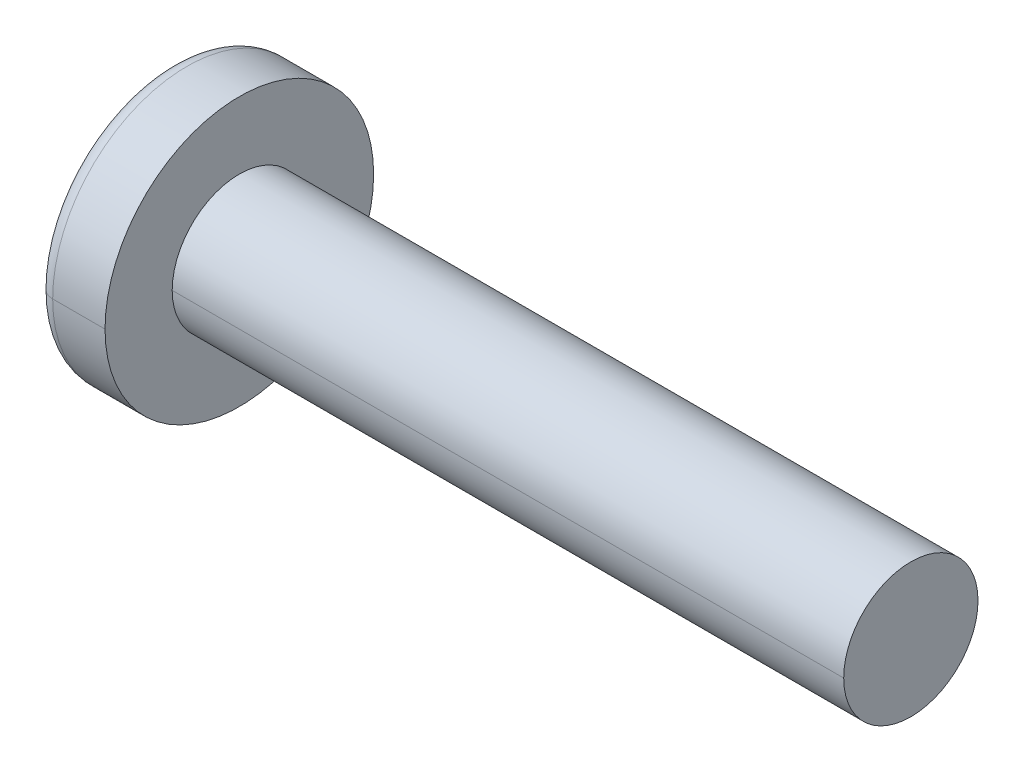
ISO-10303-21;
HEADER;
FILE_DESCRIPTION(('STEP AP214'),'2;1');
FILE_NAME('part.step','',(''),(''),'','','');
FILE_SCHEMA(('AUTOMOTIVE_DESIGN { 1 0 10303 214 1 1 1 1 }'));
ENDSEC;
DATA;
#1=APPLICATION_CONTEXT('core data for automotive mechanical design processes');
#2=APPLICATION_PROTOCOL_DEFINITION('international standard','automotive_design',2000,#1);
#3=PRODUCT_CONTEXT('',#1,'mechanical');
#4=PRODUCT('Part','Part','',(#3));
#5=PRODUCT_RELATED_PRODUCT_CATEGORY('part','',(#4));
#6=PRODUCT_DEFINITION_FORMATION('','',#4);
#7=PRODUCT_DEFINITION_CONTEXT('part definition',#1,'design');
#8=PRODUCT_DEFINITION('design','',#6,#7);
#9=PRODUCT_DEFINITION_SHAPE('','',#8);
#10=(LENGTH_UNIT() NAMED_UNIT(*) SI_UNIT(.MILLI.,.METRE.));
#11=(NAMED_UNIT(*) PLANE_ANGLE_UNIT() SI_UNIT($,.RADIAN.));
#12=(NAMED_UNIT(*) SI_UNIT($,.STERADIAN.) SOLID_ANGLE_UNIT());
#13=UNCERTAINTY_MEASURE_WITH_UNIT(LENGTH_MEASURE(1.E-05),#10,'distance_accuracy_value','');
#14=(GEOMETRIC_REPRESENTATION_CONTEXT(3) GLOBAL_UNCERTAINTY_ASSIGNED_CONTEXT((#13)) GLOBAL_UNIT_ASSIGNED_CONTEXT((#10,
#11,#12)) REPRESENTATION_CONTEXT('',''));
#15=CARTESIAN_POINT('',(0.,0.,0.));
#16=DIRECTION('',(0.,0.,1.));
#17=DIRECTION('',(1.,0.,0.));
#18=AXIS2_PLACEMENT_3D('',#15,#16,#17);
#19=CARTESIAN_POINT('',(1.37075949367089,-0.101772151898734,0.));
#20=DIRECTION('',(-0.100331502261417,0.994954064092392,0.));
#21=DIRECTION('',(0.,0.,1.));
#22=AXIS2_PLACEMENT_3D('',#19,#20,#21);
#23=PLANE('',#22);
#24=CARTESIAN_POINT('',(3.19174554351625,0.081856693463823,0.));
#25=DIRECTION('',(-0.100331502261417,0.994954064092392,0.));
#26=DIRECTION('',(-0.994954064092392,-0.100331502261417,0.));
#27=AXIS2_PLACEMENT_3D('',#24,#25,#26);
#28=CIRCLE('',#27,3.1989422229361);
#29=CARTESIAN_POINT('',(0.0177814447975943,-0.238206913129655,0.238206913129654));
#30=VERTEX_POINT('',#29);
#31=CARTESIAN_POINT('',(0.118330716626355,-0.22806749076037,0.831444314172419));
#32=VERTEX_POINT('',#31);
#33=EDGE_CURVE('E231',#30,#32,#28,.T.);
#34=ORIENTED_EDGE('',*,*,#33,.T.);
#35=DIRECTION('',(0.830201128729582,0.0837177608802956,-0.551141925795269));
#36=VECTOR('',#35,1.);
#37=CARTESIAN_POINT('',(0.,-0.240000000000002,0.91));
#38=LINE('',#37,#36);
#39=CARTESIAN_POINT('',(1.19,-0.12,0.12));
#40=VERTEX_POINT('',#39);
#41=EDGE_CURVE('E11',#32,#40,#38,.T.);
#42=ORIENTED_EDGE('',*,*,#41,.T.);
#43=DIRECTION('',(0.989983749746914,0.0998302940921256,-0.0998302940921253));
#44=VECTOR('',#43,1.);
#45=CARTESIAN_POINT('',(1.38081767298512,-0.100757881715786,0.100757881715786));
#46=LINE('',#45,#44);
#47=EDGE_CURVE('E207',#30,#40,#46,.T.);
#48=ORIENTED_EDGE('',*,*,#47,.F.);
#49=EDGE_LOOP('',(#34,#42,#48));
#50=FACE_BOUND('',#49,.T.);
#51=ADVANCED_FACE('F16',(#50),#23,.T.);
#52=CARTESIAN_POINT('',(1.37075949367089,0.101772151898734,0.));
#53=DIRECTION('',(-0.100331502261418,-0.994954064092392,0.));
#54=DIRECTION('',(-0.994954064092392,0.100331502261418,0.));
#55=AXIS2_PLACEMENT_3D('',#52,#53,#54);
#56=PLANE('',#55);
#57=CARTESIAN_POINT('',(3.19174554351626,-0.0818566934638239,0.));
#58=DIRECTION('',(-0.100331502261418,-0.994954064092392,0.));
#59=DIRECTION('',(0.994954064092392,-0.100331502261418,0.));
#60=AXIS2_PLACEMENT_3D('',#57,#58,#59);
#61=CIRCLE('',#60,3.1989422229361);
#62=CARTESIAN_POINT('',(0.118330716626357,0.228067490760365,0.831444314172419));
#63=VERTEX_POINT('',#62);
#64=CARTESIAN_POINT('',(0.0177814447975952,0.238206913129654,0.238206913129654));
#65=VERTEX_POINT('',#64);
#66=EDGE_CURVE('E302',#63,#65,#61,.T.);
#67=ORIENTED_EDGE('',*,*,#66,.T.);
#68=DIRECTION('',(-0.989983749746914,0.0998302940921254,0.0998302940921253));
#69=VECTOR('',#68,1.);
#70=CARTESIAN_POINT('',(1.38081767298512,0.100757881715786,0.100757881715786));
#71=LINE('',#70,#69);
#72=CARTESIAN_POINT('',(1.19,0.12,0.12));
#73=VERTEX_POINT('',#72);
#74=EDGE_CURVE('E204',#73,#65,#71,.T.);
#75=ORIENTED_EDGE('',*,*,#74,.F.);
#76=DIRECTION('',(0.830201128729582,-0.0837177608802921,-0.551141925795269));
#77=VECTOR('',#76,1.);
#78=CARTESIAN_POINT('',(0.,0.239999999999997,0.91));
#79=LINE('',#78,#77);
#80=EDGE_CURVE('E27',#63,#73,#79,.T.);
#81=ORIENTED_EDGE('',*,*,#80,.F.);
#82=EDGE_LOOP('',(#67,#75,#81));
#83=FACE_BOUND('',#82,.T.);
#84=ADVANCED_FACE('F18',(#83),#56,.T.);
#85=CARTESIAN_POINT('',(1.19,-0.12,0.12));
#86=DIRECTION('',(0.553083521918191,0.,0.833125811497021));
#87=DIRECTION('',(0.,-1.,0.));
#88=AXIS2_PLACEMENT_3D('',#85,#86,#87);
#89=PLANE('',#88);
#90=ORIENTED_EDGE('',*,*,#80,.T.);
#91=DIRECTION('',(0.,-1.,0.));
#92=VECTOR('',#91,1.);
#93=CARTESIAN_POINT('',(1.19,0.12,0.12));
#94=LINE('',#93,#92);
#95=EDGE_CURVE('E293',#73,#40,#94,.T.);
#96=ORIENTED_EDGE('',*,*,#95,.T.);
#97=ORIENTED_EDGE('',*,*,#41,.F.);
#98=CARTESIAN_POINT('',(2.64043280070582,0.,-0.842892363493775));
#99=DIRECTION('',(0.553083521918191,0.,0.833125811497021));
#100=DIRECTION('',(0.833125811497021,0.,-0.553083521918191));
#101=AXIS2_PLACEMENT_3D('',#98,#99,#100);
#102=CIRCLE('',#101,3.03585523585001);
#103=EDGE_CURVE('E288',#63,#32,#102,.T.);
#104=ORIENTED_EDGE('',*,*,#103,.F.);
#105=EDGE_LOOP('',(#90,#96,#97,#104));
#106=FACE_BOUND('',#105,.T.);
#107=ADVANCED_FACE('F397',(#106),#89,.F.);
#108=CARTESIAN_POINT('',(1.37075949367089,0.101772151898734,0.));
#109=DIRECTION('',(-0.100331502261418,-0.994954064092392,0.));
#110=DIRECTION('',(-0.994954064092392,0.100331502261418,0.));
#111=AXIS2_PLACEMENT_3D('',#108,#109,#110);
#112=PLANE('',#111);
#113=CARTESIAN_POINT('',(3.19174554351626,-0.0818566934638239,0.));
#114=DIRECTION('',(-0.100331502261418,-0.994954064092392,0.));
#115=DIRECTION('',(0.994954064092392,-0.100331502261418,0.));
#116=AXIS2_PLACEMENT_3D('',#113,#114,#115);
#117=CIRCLE('',#116,3.1989422229361);
#118=CARTESIAN_POINT('',(0.0177814447975956,0.238206913129655,-0.238206913129654));
#119=VERTEX_POINT('',#118);
#120=CARTESIAN_POINT('',(0.118330716626357,0.228067490760371,-0.831444314172417));
#121=VERTEX_POINT('',#120);
#122=EDGE_CURVE('E182',#119,#121,#117,.T.);
#123=ORIENTED_EDGE('',*,*,#122,.T.);
#124=DIRECTION('',(0.830201128729583,-0.083717760880296,0.551141925795268));
#125=VECTOR('',#124,1.);
#126=CARTESIAN_POINT('',(0.,0.240000000000003,-0.91));
#127=LINE('',#126,#125);
#128=CARTESIAN_POINT('',(1.19,0.12,-0.12));
#129=VERTEX_POINT('',#128);
#130=EDGE_CURVE('E236',#121,#129,#127,.T.);
#131=ORIENTED_EDGE('',*,*,#130,.T.);
#132=DIRECTION('',(0.989983749746913,-0.0998302940921261,0.0998302940921258));
#133=VECTOR('',#132,1.);
#134=CARTESIAN_POINT('',(1.38081767298512,0.100757881715786,-0.100757881715786));
#135=LINE('',#134,#133);
#136=EDGE_CURVE('E162',#119,#129,#135,.T.);
#137=ORIENTED_EDGE('',*,*,#136,.F.);
#138=EDGE_LOOP('',(#123,#131,#137));
#139=FACE_BOUND('',#138,.T.);
#140=ADVANCED_FACE('F399',(#139),#112,.T.);
#141=CARTESIAN_POINT('',(1.37075949367089,-0.101772151898734,0.));
#142=DIRECTION('',(-0.100331502261417,0.994954064092392,0.));
#143=DIRECTION('',(0.,0.,1.));
#144=AXIS2_PLACEMENT_3D('',#141,#142,#143);
#145=PLANE('',#144);
#146=CARTESIAN_POINT('',(3.19174554351625,0.081856693463823,0.));
#147=DIRECTION('',(-0.100331502261417,0.994954064092392,0.));
#148=DIRECTION('',(-0.994954064092392,-0.100331502261417,0.));
#149=AXIS2_PLACEMENT_3D('',#146,#147,#148);
#150=CIRCLE('',#149,3.1989422229361);
#151=CARTESIAN_POINT('',(0.118330716626356,-0.228067490760364,-0.831444314172419));
#152=VERTEX_POINT('',#151);
#153=CARTESIAN_POINT('',(0.0177814447975943,-0.238206913129653,-0.238206913129655));
#154=VERTEX_POINT('',#153);
#155=EDGE_CURVE('E195',#152,#154,#150,.T.);
#156=ORIENTED_EDGE('',*,*,#155,.T.);
#157=DIRECTION('',(-0.989983749746914,-0.0998302940921249,-0.0998302940921257));
#158=VECTOR('',#157,1.);
#159=CARTESIAN_POINT('',(1.38081767298512,-0.100757881715786,-0.100757881715786));
#160=LINE('',#159,#158);
#161=CARTESIAN_POINT('',(1.19,-0.12,-0.12));
#162=VERTEX_POINT('',#161);
#163=EDGE_CURVE('E377',#162,#154,#160,.T.);
#164=ORIENTED_EDGE('',*,*,#163,.F.);
#165=DIRECTION('',(0.830201128729583,0.0837177608802917,0.551141925795268));
#166=VECTOR('',#165,1.);
#167=CARTESIAN_POINT('',(0.,-0.239999999999996,-0.91));
#168=LINE('',#167,#166);
#169=EDGE_CURVE('E239',#152,#162,#168,.T.);
#170=ORIENTED_EDGE('',*,*,#169,.F.);
#171=EDGE_LOOP('',(#156,#164,#170));
#172=FACE_BOUND('',#171,.T.);
#173=ADVANCED_FACE('F405',(#172),#145,.T.);
#174=CARTESIAN_POINT('',(0.,0.240000000000003,-0.91));
#175=DIRECTION('',(0.55308352191819,0.,-0.833125811497022));
#176=DIRECTION('',(0.,-1.,0.));
#177=AXIS2_PLACEMENT_3D('',#174,#175,#176);
#178=PLANE('',#177);
#179=ORIENTED_EDGE('',*,*,#169,.T.);
#180=DIRECTION('',(0.,1.,0.));
#181=VECTOR('',#180,1.);
#182=CARTESIAN_POINT('',(1.19,-0.12,-0.12));
#183=LINE('',#182,#181);
#184=EDGE_CURVE('E289',#162,#129,#183,.T.);
#185=ORIENTED_EDGE('',*,*,#184,.T.);
#186=ORIENTED_EDGE('',*,*,#130,.F.);
#187=CARTESIAN_POINT('',(2.64043280070582,0.,0.842892363493774));
#188=DIRECTION('',(0.55308352191819,0.,-0.833125811497022));
#189=DIRECTION('',(-0.833125811497022,0.,-0.55308352191819));
#190=AXIS2_PLACEMENT_3D('',#187,#188,#189);
#191=CIRCLE('',#190,3.03585523585001);
#192=EDGE_CURVE('E190',#152,#121,#191,.T.);
#193=ORIENTED_EDGE('',*,*,#192,.F.);
#194=EDGE_LOOP('',(#179,#185,#186,#193));
#195=FACE_BOUND('',#194,.T.);
#196=ADVANCED_FACE('F446',(#195),#178,.F.);
#197=CARTESIAN_POINT('',(1.19,0.12,-0.12));
#198=DIRECTION('',(-1.,0.,0.));
#199=DIRECTION('',(0.,0.,1.));
#200=AXIS2_PLACEMENT_3D('',#197,#198,#199);
#201=PLANE('',#200);
#202=ORIENTED_EDGE('',*,*,#184,.F.);
#203=DIRECTION('',(0.,0.,1.));
#204=VECTOR('',#203,1.);
#205=CARTESIAN_POINT('',(1.19,-0.12,-0.12));
#206=LINE('',#205,#204);
#207=EDGE_CURVE('E294',#162,#40,#206,.T.);
#208=ORIENTED_EDGE('',*,*,#207,.T.);
#209=ORIENTED_EDGE('',*,*,#95,.F.);
#210=DIRECTION('',(0.,0.,-1.));
#211=VECTOR('',#210,1.);
#212=CARTESIAN_POINT('',(1.19,0.12,0.12));
#213=LINE('',#212,#211);
#214=EDGE_CURVE('E211',#73,#129,#213,.T.);
#215=ORIENTED_EDGE('',*,*,#214,.T.);
#216=EDGE_LOOP('',(#202,#208,#209,#215));
#217=FACE_BOUND('',#216,.T.);
#218=ADVANCED_FACE('F367',(#217),#201,.T.);
#219=CARTESIAN_POINT('',(0.,-0.91,-0.24));
#220=DIRECTION('',(0.55308352191819,-0.833125811497022,0.));
#221=DIRECTION('',(0.,0.,-1.));
#222=AXIS2_PLACEMENT_3D('',#219,#220,#221);
#223=PLANE('',#222);
#224=DIRECTION('',(0.830201128729583,0.551141925795268,-0.0837177608802937));
#225=VECTOR('',#224,1.);
#226=CARTESIAN_POINT('',(0.,-0.91,0.24));
#227=LINE('',#226,#225);
#228=CARTESIAN_POINT('',(0.118330716626355,-0.831444314172419,0.228067490760367));
#229=VERTEX_POINT('',#228);
#230=EDGE_CURVE('E215',#229,#40,#227,.T.);
#231=ORIENTED_EDGE('',*,*,#230,.T.);
#232=ORIENTED_EDGE('',*,*,#207,.F.);
#233=DIRECTION('',(0.830201128729583,0.551141925795268,0.0837177608802941));
#234=VECTOR('',#233,1.);
#235=CARTESIAN_POINT('',(0.,-0.91,-0.24));
#236=LINE('',#235,#234);
#237=CARTESIAN_POINT('',(0.118330716626355,-0.831444314172419,-0.228067490760368));
#238=VERTEX_POINT('',#237);
#239=EDGE_CURVE('E166',#238,#162,#236,.T.);
#240=ORIENTED_EDGE('',*,*,#239,.F.);
#241=CARTESIAN_POINT('',(2.64043280070582,0.842892363493772,0.));
#242=DIRECTION('',(0.55308352191819,-0.833125811497022,0.));
#243=DIRECTION('',(0.833125811497022,0.55308352191819,0.));
#244=AXIS2_PLACEMENT_3D('',#241,#242,#243);
#245=CIRCLE('',#244,3.03585523585001);
#246=CARTESIAN_POINT('',(0.111183443750788,-0.836189142383929,0.));
#247=VERTEX_POINT('',#246);
#248=EDGE_CURVE('E235',#247,#238,#245,.T.);
#249=ORIENTED_EDGE('',*,*,#248,.F.);
#250=CARTESIAN_POINT('',(2.64043280070582,0.842892363493772,0.));
#251=DIRECTION('',(0.55308352191819,-0.833125811497022,0.));
#252=DIRECTION('',(0.833125811497022,0.55308352191819,0.));
#253=AXIS2_PLACEMENT_3D('',#250,#251,#252);
#254=CIRCLE('',#253,3.03585523585001);
#255=EDGE_CURVE('E230',#229,#247,#254,.T.);
#256=ORIENTED_EDGE('',*,*,#255,.F.);
#257=EDGE_LOOP('',(#231,#232,#240,#249,#256));
#258=FACE_BOUND('',#257,.T.);
#259=ADVANCED_FACE('F389',(#258),#223,.F.);
#260=CARTESIAN_POINT('',(1.19,0.12,0.12));
#261=DIRECTION('',(0.553083521918191,0.833125811497021,0.));
#262=DIRECTION('',(0.,0.,-1.));
#263=AXIS2_PLACEMENT_3D('',#260,#261,#262);
#264=PLANE('',#263);
#265=DIRECTION('',(0.830201128729582,-0.551141925795269,0.083717760880294));
#266=VECTOR('',#265,1.);
#267=CARTESIAN_POINT('',(0.,0.91,-0.24));
#268=LINE('',#267,#266);
#269=CARTESIAN_POINT('',(0.118330716626357,0.831444314172418,-0.228067490760368));
#270=VERTEX_POINT('',#269);
#271=EDGE_CURVE('E156',#270,#129,#268,.T.);
#272=ORIENTED_EDGE('',*,*,#271,.T.);
#273=ORIENTED_EDGE('',*,*,#214,.F.);
#274=DIRECTION('',(0.830201128729582,-0.551141925795269,-0.0837177608802937));
#275=VECTOR('',#274,1.);
#276=CARTESIAN_POINT('',(0.,0.91,0.24));
#277=LINE('',#276,#275);
#278=CARTESIAN_POINT('',(0.118330716626358,0.831444314172418,0.228067490760367));
#279=VERTEX_POINT('',#278);
#280=EDGE_CURVE('E208',#279,#73,#277,.T.);
#281=ORIENTED_EDGE('',*,*,#280,.F.);
#282=CARTESIAN_POINT('',(2.64043280070582,-0.842892363493777,0.));
#283=DIRECTION('',(0.553083521918191,0.833125811497021,0.));
#284=DIRECTION('',(-0.833125811497021,0.553083521918191,0.));
#285=AXIS2_PLACEMENT_3D('',#282,#283,#284);
#286=CIRCLE('',#285,3.03585523585001);
#287=CARTESIAN_POINT('',(0.111183443750791,0.836189142383929,0.));
#288=VERTEX_POINT('',#287);
#289=EDGE_CURVE('E172',#288,#279,#286,.T.);
#290=ORIENTED_EDGE('',*,*,#289,.F.);
#291=CARTESIAN_POINT('',(2.64043280070582,-0.842892363493777,0.));
#292=DIRECTION('',(0.553083521918191,0.833125811497021,0.));
#293=DIRECTION('',(-0.833125811497021,0.553083521918191,0.));
#294=AXIS2_PLACEMENT_3D('',#291,#292,#293);
#295=CIRCLE('',#294,3.03585523585001);
#296=EDGE_CURVE('E169',#270,#288,#295,.T.);
#297=ORIENTED_EDGE('',*,*,#296,.F.);
#298=EDGE_LOOP('',(#272,#273,#281,#290,#297));
#299=FACE_BOUND('',#298,.T.);
#300=ADVANCED_FACE('F170',(#299),#264,.F.);
#301=CARTESIAN_POINT('',(11.6,1.,0.));
#302=DIRECTION('',(1.,0.,0.));
#303=DIRECTION('',(0.,1.,0.));
#304=AXIS2_PLACEMENT_3D('',#301,#302,#303);
#305=PLANE('',#304);
#306=CARTESIAN_POINT('',(11.6,0.,0.));
#307=DIRECTION('',(-1.,0.,0.));
#308=DIRECTION('',(0.,0.,1.));
#309=AXIS2_PLACEMENT_3D('',#306,#307,#308);
#310=CIRCLE('',#309,1.);
#311=CARTESIAN_POINT('',(11.6,0.,1.));
#312=VERTEX_POINT('',#311);
#313=CARTESIAN_POINT('',(11.6,0.,-1.));
#314=VERTEX_POINT('',#313);
#315=EDGE_CURVE('E216',#312,#314,#310,.T.);
#316=ORIENTED_EDGE('',*,*,#315,.F.);
#317=CARTESIAN_POINT('',(11.6,0.,0.));
#318=DIRECTION('',(-1.,0.,0.));
#319=DIRECTION('',(0.,0.,1.));
#320=AXIS2_PLACEMENT_3D('',#317,#318,#319);
#321=CIRCLE('',#320,1.);
#322=EDGE_CURVE('E212',#314,#312,#321,.T.);
#323=ORIENTED_EDGE('',*,*,#322,.F.);
#324=EDGE_LOOP('',(#316,#323));
#325=FACE_BOUND('',#324,.T.);
#326=ADVANCED_FACE('F422',(#325),#305,.T.);
#327=CARTESIAN_POINT('',(0.820084035097042,0.,0.));
#328=DIRECTION('',(-1.,0.,0.));
#329=DIRECTION('',(0.,0.,1.));
#330=AXIS2_PLACEMENT_3D('',#327,#328,#329);
#331=TOROIDAL_SURFACE('',#330,1.76,0.24);
#332=CARTESIAN_POINT('',(0.820084035097042,0.,-1.76));
#333=DIRECTION('',(0.,1.,0.));
#334=DIRECTION('',(0.,0.,1.));
#335=AXIS2_PLACEMENT_3D('',#332,#333,#334);
#336=CIRCLE('',#335,0.24);
#337=CARTESIAN_POINT('',(0.820084035097042,0.,-2.));
#338=VERTEX_POINT('',#337);
#339=CARTESIAN_POINT('',(0.627117875780583,0.,-1.90270270270271));
#340=VERTEX_POINT('',#339);
#341=EDGE_CURVE('E243',#338,#340,#336,.T.);
#342=ORIENTED_EDGE('',*,*,#341,.F.);
#343=CARTESIAN_POINT('',(0.820084035097042,0.,0.));
#344=DIRECTION('',(-1.,0.,0.));
#345=DIRECTION('',(0.,0.,1.));
#346=AXIS2_PLACEMENT_3D('',#343,#344,#345);
#347=CIRCLE('',#346,2.);
#348=CARTESIAN_POINT('',(0.820084035097042,0.,2.));
#349=VERTEX_POINT('',#348);
#350=EDGE_CURVE('E202',#338,#349,#347,.T.);
#351=ORIENTED_EDGE('',*,*,#350,.T.);
#352=CARTESIAN_POINT('',(0.820084035097042,0.,1.76));
#353=DIRECTION('',(0.,-1.,0.));
#354=DIRECTION('',(0.,0.,-1.));
#355=AXIS2_PLACEMENT_3D('',#352,#353,#354);
#356=CIRCLE('',#355,0.24);
#357=CARTESIAN_POINT('',(0.627117875780583,0.,1.90270270270271));
#358=VERTEX_POINT('',#357);
#359=EDGE_CURVE('E251',#349,#358,#356,.T.);
#360=ORIENTED_EDGE('',*,*,#359,.T.);
#361=CARTESIAN_POINT('',(0.627117875780583,0.,0.));
#362=DIRECTION('',(-1.,0.,0.));
#363=DIRECTION('',(0.,0.,1.));
#364=AXIS2_PLACEMENT_3D('',#361,#362,#363);
#365=CIRCLE('',#364,1.90270270270271);
#366=CARTESIAN_POINT('',(0.627117875780583,-1.90270270270271,0.));
#367=VERTEX_POINT('',#366);
#368=EDGE_CURVE('E321',#367,#358,#365,.T.);
#369=ORIENTED_EDGE('',*,*,#368,.F.);
#370=CARTESIAN_POINT('',(0.627117875780583,0.,0.));
#371=DIRECTION('',(-1.,0.,0.));
#372=DIRECTION('',(0.,0.,1.));
#373=AXIS2_PLACEMENT_3D('',#370,#371,#372);
#374=CIRCLE('',#373,1.90270270270271);
#375=EDGE_CURVE('E315',#340,#367,#374,.T.);
#376=ORIENTED_EDGE('',*,*,#375,.F.);
#377=EDGE_LOOP('',(#342,#351,#360,#369,#376));
#378=FACE_BOUND('',#377,.T.);
#379=ADVANCED_FACE('F415',(#378),#331,.T.);
#380=CARTESIAN_POINT('',(-25.4,0.,0.));
#381=DIRECTION('',(-1.,0.,0.));
#382=DIRECTION('',(0.,0.,1.));
#383=AXIS2_PLACEMENT_3D('',#380,#381,#382);
#384=CYLINDRICAL_SURFACE('',#383,2.);
#385=DIRECTION('',(-1.,0.,0.));
#386=VECTOR('',#385,1.);
#387=CARTESIAN_POINT('',(-25.4,0.,-2.));
#388=LINE('',#387,#386);
#389=CARTESIAN_POINT('',(1.6,0.,-2.));
#390=VERTEX_POINT('',#389);
#391=EDGE_CURVE('E20',#390,#338,#388,.T.);
#392=ORIENTED_EDGE('',*,*,#391,.F.);
#393=CARTESIAN_POINT('',(1.6,0.,0.));
#394=DIRECTION('',(-1.,0.,0.));
#395=DIRECTION('',(0.,0.,1.));
#396=AXIS2_PLACEMENT_3D('',#393,#394,#395);
#397=CIRCLE('',#396,2.);
#398=CARTESIAN_POINT('',(1.6,0.,2.));
#399=VERTEX_POINT('',#398);
#400=EDGE_CURVE('E199',#390,#399,#397,.T.);
#401=ORIENTED_EDGE('',*,*,#400,.T.);
#402=DIRECTION('',(-1.,0.,0.));
#403=VECTOR('',#402,1.);
#404=CARTESIAN_POINT('',(-25.4,0.,2.));
#405=LINE('',#404,#403);
#406=EDGE_CURVE('E221',#399,#349,#405,.T.);
#407=ORIENTED_EDGE('',*,*,#406,.T.);
#408=ORIENTED_EDGE('',*,*,#350,.F.);
#409=EDGE_LOOP('',(#392,#401,#407,#408));
#410=FACE_BOUND('',#409,.T.);
#411=ADVANCED_FACE('F437',(#410),#384,.T.);
#412=CARTESIAN_POINT('',(1.6,1.,0.));
#413=DIRECTION('',(-1.,0.,0.));
#414=DIRECTION('',(0.,0.,1.));
#415=AXIS2_PLACEMENT_3D('',#412,#413,#414);
#416=PLANE('',#415);
#417=CARTESIAN_POINT('',(1.6,0.,0.));
#418=DIRECTION('',(-1.,0.,0.));
#419=DIRECTION('',(0.,0.,1.));
#420=AXIS2_PLACEMENT_3D('',#417,#418,#419);
#421=CIRCLE('',#420,1.);
#422=CARTESIAN_POINT('',(1.6,0.,1.));
#423=VERTEX_POINT('',#422);
#424=CARTESIAN_POINT('',(1.6,0.,-1.));
#425=VERTEX_POINT('',#424);
#426=EDGE_CURVE('E225',#423,#425,#421,.T.);
#427=ORIENTED_EDGE('',*,*,#426,.T.);
#428=CARTESIAN_POINT('',(1.6,0.,0.));
#429=DIRECTION('',(-1.,0.,0.));
#430=DIRECTION('',(0.,0.,1.));
#431=AXIS2_PLACEMENT_3D('',#428,#429,#430);
#432=CIRCLE('',#431,1.);
#433=EDGE_CURVE('E203',#425,#423,#432,.T.);
#434=ORIENTED_EDGE('',*,*,#433,.T.);
#435=EDGE_LOOP('',(#427,#434));
#436=FACE_BOUND('',#435,.T.);
#437=CARTESIAN_POINT('',(1.6,0.,0.));
#438=DIRECTION('',(-1.,0.,0.));
#439=DIRECTION('',(0.,0.,1.));
#440=AXIS2_PLACEMENT_3D('',#437,#438,#439);
#441=CIRCLE('',#440,2.);
#442=EDGE_CURVE('E259',#399,#390,#441,.T.);
#443=ORIENTED_EDGE('',*,*,#442,.F.);
#444=ORIENTED_EDGE('',*,*,#400,.F.);
#445=EDGE_LOOP('',(#443,#444));
#446=FACE_BOUND('',#445,.T.);
#447=ADVANCED_FACE('F434',(#436,#446),#416,.F.);
#448=CARTESIAN_POINT('',(-25.4,0.,0.));
#449=DIRECTION('',(-1.,0.,0.));
#450=DIRECTION('',(0.,0.,1.));
#451=AXIS2_PLACEMENT_3D('',#448,#449,#450);
#452=CYLINDRICAL_SURFACE('',#451,1.);
#453=DIRECTION('',(-1.,0.,0.));
#454=VECTOR('',#453,1.);
#455=CARTESIAN_POINT('',(-25.4,0.,-1.));
#456=LINE('',#455,#454);
#457=EDGE_CURVE('E220',#314,#425,#456,.T.);
#458=ORIENTED_EDGE('',*,*,#457,.F.);
#459=ORIENTED_EDGE('',*,*,#322,.T.);
#460=DIRECTION('',(-1.,0.,0.));
#461=VECTOR('',#460,1.);
#462=CARTESIAN_POINT('',(-25.4,0.,1.));
#463=LINE('',#462,#461);
#464=EDGE_CURVE('E256',#312,#423,#463,.T.);
#465=ORIENTED_EDGE('',*,*,#464,.T.);
#466=ORIENTED_EDGE('',*,*,#433,.F.);
#467=EDGE_LOOP('',(#458,#459,#465,#466));
#468=FACE_BOUND('',#467,.T.);
#469=ADVANCED_FACE('F433',(#468),#452,.T.);
#470=CARTESIAN_POINT('',(1.37075949367089,0.,0.101772151898734));
#471=DIRECTION('',(-0.100331502261417,0.,-0.994954064092392));
#472=DIRECTION('',(-0.994954064092392,0.,0.100331502261417));
#473=AXIS2_PLACEMENT_3D('',#470,#471,#472);
#474=PLANE('',#473);
#475=CARTESIAN_POINT('',(3.19174554351626,0.,-0.081856693463823));
#476=DIRECTION('',(-0.100331502261417,0.,-0.994954064092392));
#477=DIRECTION('',(-0.994954064092392,0.,0.100331502261417));
#478=AXIS2_PLACEMENT_3D('',#475,#476,#477);
#479=CIRCLE('',#478,3.1989422229361);
#480=EDGE_CURVE('E226',#229,#30,#479,.T.);
#481=ORIENTED_EDGE('',*,*,#480,.T.);
#482=ORIENTED_EDGE('',*,*,#47,.T.);
#483=ORIENTED_EDGE('',*,*,#230,.F.);
#484=EDGE_LOOP('',(#481,#482,#483));
#485=FACE_BOUND('',#484,.T.);
#486=ADVANCED_FACE('F394',(#485),#474,.T.);
#487=CARTESIAN_POINT('',(1.37075949367089,0.,0.101772151898734));
#488=DIRECTION('',(-0.100331502261417,0.,-0.994954064092392));
#489=DIRECTION('',(-0.994954064092392,0.,0.100331502261417));
#490=AXIS2_PLACEMENT_3D('',#487,#488,#489);
#491=PLANE('',#490);
#492=ORIENTED_EDGE('',*,*,#280,.T.);
#493=ORIENTED_EDGE('',*,*,#74,.T.);
#494=CARTESIAN_POINT('',(3.19174554351626,0.,-0.081856693463823));
#495=DIRECTION('',(-0.100331502261417,0.,-0.994954064092392));
#496=DIRECTION('',(-0.994954064092392,0.,0.100331502261417));
#497=AXIS2_PLACEMENT_3D('',#494,#495,#496);
#498=CIRCLE('',#497,3.1989422229361);
#499=EDGE_CURVE('E322',#65,#279,#498,.T.);
#500=ORIENTED_EDGE('',*,*,#499,.T.);
#501=EDGE_LOOP('',(#492,#493,#500));
#502=FACE_BOUND('',#501,.T.);
#503=ADVANCED_FACE('F375',(#502),#491,.T.);
#504=CARTESIAN_POINT('',(1.37075949367089,0.,-0.101772151898734));
#505=DIRECTION('',(-0.100331502261418,0.,0.994954064092392));
#506=DIRECTION('',(0.,1.,0.));
#507=AXIS2_PLACEMENT_3D('',#504,#505,#506);
#508=PLANE('',#507);
#509=ORIENTED_EDGE('',*,*,#239,.T.);
#510=ORIENTED_EDGE('',*,*,#163,.T.);
#511=CARTESIAN_POINT('',(3.19174554351626,0.,0.0818566934638239));
#512=DIRECTION('',(-0.100331502261418,0.,0.994954064092392));
#513=DIRECTION('',(0.994954064092392,0.,0.100331502261418));
#514=AXIS2_PLACEMENT_3D('',#511,#512,#513);
#515=CIRCLE('',#514,3.1989422229361);
#516=EDGE_CURVE('E198',#154,#238,#515,.T.);
#517=ORIENTED_EDGE('',*,*,#516,.T.);
#518=EDGE_LOOP('',(#509,#510,#517));
#519=FACE_BOUND('',#518,.T.);
#520=ADVANCED_FACE('F419',(#519),#508,.T.);
#521=CARTESIAN_POINT('',(1.37075949367089,0.,-0.101772151898734));
#522=DIRECTION('',(-0.100331502261418,0.,0.994954064092392));
#523=DIRECTION('',(0.,1.,0.));
#524=AXIS2_PLACEMENT_3D('',#521,#522,#523);
#525=PLANE('',#524);
#526=CARTESIAN_POINT('',(3.19174554351626,0.,0.0818566934638239));
#527=DIRECTION('',(-0.100331502261418,0.,0.994954064092392));
#528=DIRECTION('',(0.994954064092392,0.,0.100331502261418));
#529=AXIS2_PLACEMENT_3D('',#526,#527,#528);
#530=CIRCLE('',#529,3.1989422229361);
#531=EDGE_CURVE('E160',#270,#119,#530,.T.);
#532=ORIENTED_EDGE('',*,*,#531,.T.);
#533=ORIENTED_EDGE('',*,*,#136,.T.);
#534=ORIENTED_EDGE('',*,*,#271,.F.);
#535=EDGE_LOOP('',(#532,#533,#534));
#536=FACE_BOUND('',#535,.T.);
#537=ADVANCED_FACE('F158',(#536),#525,.T.);
#538=CARTESIAN_POINT('',(3.2,0.,0.));
#539=DIRECTION('',(0.,0.,-1.));
#540=DIRECTION('',(0.,1.,0.));
#541=AXIS2_PLACEMENT_3D('',#538,#539,#540);
#542=SPHERICAL_SURFACE('',#541,3.2);
#543=CARTESIAN_POINT('',(3.2,0.,0.));
#544=DIRECTION('',(0.,0.,-1.));
#545=DIRECTION('',(0.,1.,0.));
#546=AXIS2_PLACEMENT_3D('',#543,#544,#545);
#547=CIRCLE('',#546,3.2);
#548=EDGE_CURVE('E311',#367,#247,#547,.T.);
#549=ORIENTED_EDGE('',*,*,#548,.F.);
#550=ORIENTED_EDGE('',*,*,#368,.T.);
#551=CARTESIAN_POINT('',(0.627117875780583,0.,0.));
#552=DIRECTION('',(-1.,0.,0.));
#553=DIRECTION('',(0.,0.,1.));
#554=AXIS2_PLACEMENT_3D('',#551,#552,#553);
#555=CIRCLE('',#554,1.90270270270271);
#556=CARTESIAN_POINT('',(0.627117875780583,1.9027027027027,0.));
#557=VERTEX_POINT('',#556);
#558=EDGE_CURVE('E247',#358,#557,#555,.T.);
#559=ORIENTED_EDGE('',*,*,#558,.T.);
#560=CARTESIAN_POINT('',(3.2,0.,0.));
#561=DIRECTION('',(0.,0.,1.));
#562=DIRECTION('',(1.,0.,0.));
#563=AXIS2_PLACEMENT_3D('',#560,#561,#562);
#564=CIRCLE('',#563,3.2);
#565=EDGE_CURVE('E176',#557,#288,#564,.T.);
#566=ORIENTED_EDGE('',*,*,#565,.T.);
#567=ORIENTED_EDGE('',*,*,#289,.T.);
#568=ORIENTED_EDGE('',*,*,#499,.F.);
#569=ORIENTED_EDGE('',*,*,#66,.F.);
#570=ORIENTED_EDGE('',*,*,#103,.T.);
#571=ORIENTED_EDGE('',*,*,#33,.F.);
#572=ORIENTED_EDGE('',*,*,#480,.F.);
#573=ORIENTED_EDGE('',*,*,#255,.T.);
#574=EDGE_LOOP('',(#549,#550,#559,#566,#567,#568,#569,#570,#571,#572,#573));
#575=FACE_BOUND('',#574,.T.);
#576=ADVANCED_FACE('F396',(#575),#542,.T.);
#577=CARTESIAN_POINT('',(3.2,0.,0.));
#578=DIRECTION('',(0.,0.,-1.));
#579=DIRECTION('',(0.,1.,0.));
#580=AXIS2_PLACEMENT_3D('',#577,#578,#579);
#581=SPHERICAL_SURFACE('',#580,3.2);
#582=CARTESIAN_POINT('',(0.627117875780583,0.,0.));
#583=DIRECTION('',(-1.,0.,0.));
#584=DIRECTION('',(0.,0.,1.));
#585=AXIS2_PLACEMENT_3D('',#582,#583,#584);
#586=CIRCLE('',#585,1.90270270270271);
#587=EDGE_CURVE('E252',#557,#340,#586,.T.);
#588=ORIENTED_EDGE('',*,*,#587,.T.);
#589=ORIENTED_EDGE('',*,*,#375,.T.);
#590=ORIENTED_EDGE('',*,*,#548,.T.);
#591=ORIENTED_EDGE('',*,*,#248,.T.);
#592=ORIENTED_EDGE('',*,*,#516,.F.);
#593=ORIENTED_EDGE('',*,*,#155,.F.);
#594=ORIENTED_EDGE('',*,*,#192,.T.);
#595=ORIENTED_EDGE('',*,*,#122,.F.);
#596=ORIENTED_EDGE('',*,*,#531,.F.);
#597=ORIENTED_EDGE('',*,*,#296,.T.);
#598=ORIENTED_EDGE('',*,*,#565,.F.);
#599=EDGE_LOOP('',(#588,#589,#590,#591,#592,#593,#594,#595,#596,#597,#598));
#600=FACE_BOUND('',#599,.T.);
#601=ADVANCED_FACE('F179',(#600),#581,.T.);
#602=CARTESIAN_POINT('',(-25.4,0.,0.));
#603=DIRECTION('',(-1.,0.,0.));
#604=DIRECTION('',(0.,0.,1.));
#605=AXIS2_PLACEMENT_3D('',#602,#603,#604);
#606=CYLINDRICAL_SURFACE('',#605,1.);
#607=ORIENTED_EDGE('',*,*,#315,.T.);
#608=ORIENTED_EDGE('',*,*,#457,.T.);
#609=ORIENTED_EDGE('',*,*,#426,.F.);
#610=ORIENTED_EDGE('',*,*,#464,.F.);
#611=EDGE_LOOP('',(#607,#608,#609,#610));
#612=FACE_BOUND('',#611,.T.);
#613=ADVANCED_FACE('F430',(#612),#606,.T.);
#614=CARTESIAN_POINT('',(-25.4,0.,0.));
#615=DIRECTION('',(-1.,0.,0.));
#616=DIRECTION('',(0.,0.,1.));
#617=AXIS2_PLACEMENT_3D('',#614,#615,#616);
#618=CYLINDRICAL_SURFACE('',#617,2.);
#619=ORIENTED_EDGE('',*,*,#442,.T.);
#620=ORIENTED_EDGE('',*,*,#391,.T.);
#621=CARTESIAN_POINT('',(0.820084035097042,0.,0.));
#622=DIRECTION('',(-1.,0.,0.));
#623=DIRECTION('',(0.,0.,1.));
#624=AXIS2_PLACEMENT_3D('',#621,#622,#623);
#625=CIRCLE('',#624,2.);
#626=EDGE_CURVE('E240',#349,#338,#625,.T.);
#627=ORIENTED_EDGE('',*,*,#626,.F.);
#628=ORIENTED_EDGE('',*,*,#406,.F.);
#629=EDGE_LOOP('',(#619,#620,#627,#628));
#630=FACE_BOUND('',#629,.T.);
#631=ADVANCED_FACE('F450',(#630),#618,.T.);
#632=CARTESIAN_POINT('',(0.820084035097042,0.,0.));
#633=DIRECTION('',(-1.,0.,0.));
#634=DIRECTION('',(0.,0.,1.));
#635=AXIS2_PLACEMENT_3D('',#632,#633,#634);
#636=TOROIDAL_SURFACE('',#635,1.76,0.24);
#637=ORIENTED_EDGE('',*,*,#626,.T.);
#638=ORIENTED_EDGE('',*,*,#341,.T.);
#639=ORIENTED_EDGE('',*,*,#587,.F.);
#640=ORIENTED_EDGE('',*,*,#558,.F.);
#641=ORIENTED_EDGE('',*,*,#359,.F.);
#642=EDGE_LOOP('',(#637,#638,#639,#640,#641));
#643=FACE_BOUND('',#642,.T.);
#644=ADVANCED_FACE('F452',(#643),#636,.T.);
#645=CLOSED_SHELL('',(#51,#84,#107,#140,#173,#196,#218,#259,#300,#326,#379,#411,#447,#469,#486,
#503,#520,#537,#576,#601,#613,#631,#644));
#646=MANIFOLD_SOLID_BREP('B1',#645);
#647=ADVANCED_BREP_SHAPE_REPRESENTATION('',(#18,#646),#14);
#648=SHAPE_DEFINITION_REPRESENTATION(#9,#647);
ENDSEC;
END-ISO-10303-21;
